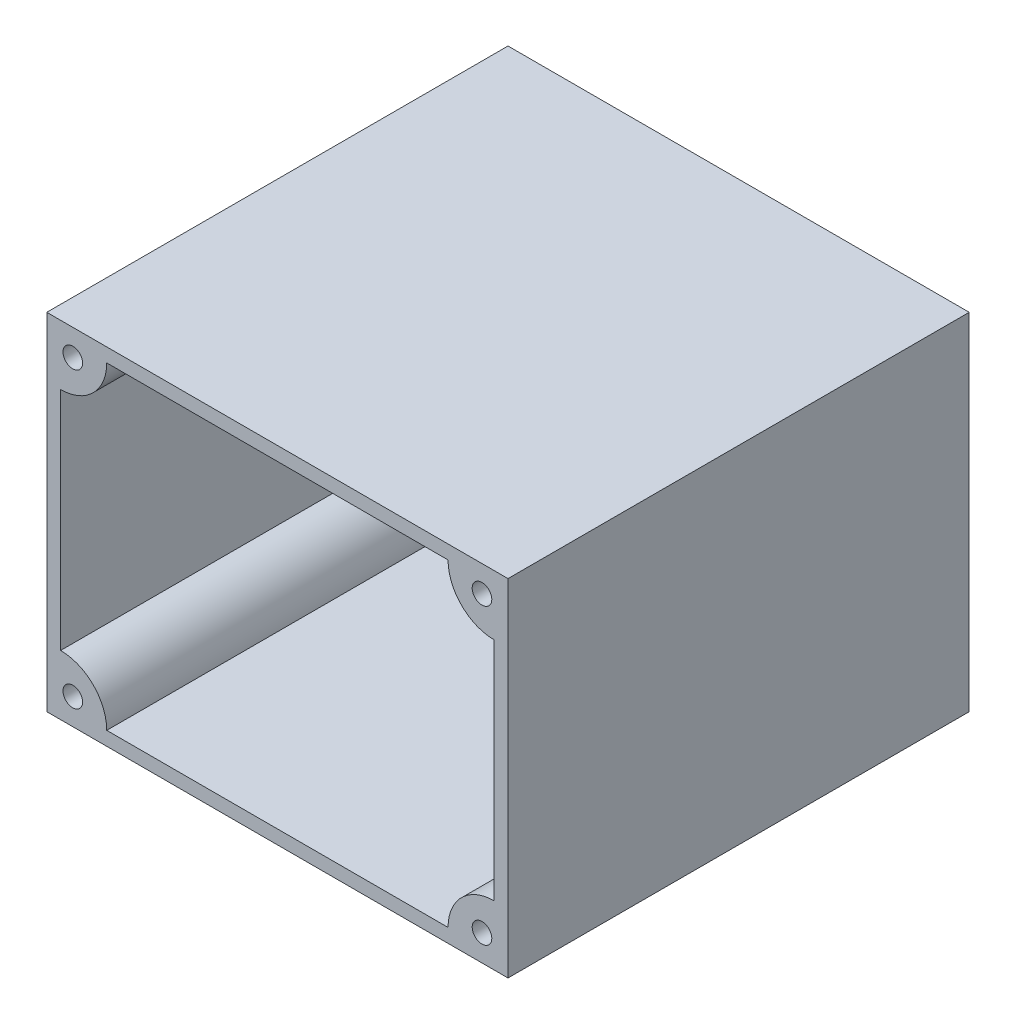
ISO-10303-21;
HEADER;
FILE_DESCRIPTION(('STEP AP214'),'2;1');
FILE_NAME('part.step','',(''),(''),'','','');
FILE_SCHEMA(('AUTOMOTIVE_DESIGN { 1 0 10303 214 1 1 1 1 }'));
ENDSEC;
DATA;
#1=APPLICATION_CONTEXT('core data for automotive mechanical design processes');
#2=APPLICATION_PROTOCOL_DEFINITION('international standard','automotive_design',2000,#1);
#3=PRODUCT_CONTEXT('',#1,'mechanical');
#4=PRODUCT('Part','Part','',(#3));
#5=PRODUCT_RELATED_PRODUCT_CATEGORY('part','',(#4));
#6=PRODUCT_DEFINITION_FORMATION('','',#4);
#7=PRODUCT_DEFINITION_CONTEXT('part definition',#1,'design');
#8=PRODUCT_DEFINITION('design','',#6,#7);
#9=PRODUCT_DEFINITION_SHAPE('','',#8);
#10=(LENGTH_UNIT() NAMED_UNIT(*) SI_UNIT(.MILLI.,.METRE.));
#11=(NAMED_UNIT(*) PLANE_ANGLE_UNIT() SI_UNIT($,.RADIAN.));
#12=(NAMED_UNIT(*) SI_UNIT($,.STERADIAN.) SOLID_ANGLE_UNIT());
#13=UNCERTAINTY_MEASURE_WITH_UNIT(LENGTH_MEASURE(1.E-05),#10,'distance_accuracy_value','');
#14=(GEOMETRIC_REPRESENTATION_CONTEXT(3) GLOBAL_UNCERTAINTY_ASSIGNED_CONTEXT((#13)) GLOBAL_UNIT_ASSIGNED_CONTEXT((#10,
#11,#12)) REPRESENTATION_CONTEXT('',''));
#15=CARTESIAN_POINT('',(0.,0.,0.));
#16=DIRECTION('',(0.,0.,1.));
#17=DIRECTION('',(1.,0.,0.));
#18=AXIS2_PLACEMENT_3D('',#15,#16,#17);
#19=CARTESIAN_POINT('',(0.,0.,2.4));
#20=DIRECTION('',(0.,0.,1.));
#21=DIRECTION('',(1.,0.,0.));
#22=AXIS2_PLACEMENT_3D('',#19,#20,#21);
#23=PLANE('',#22);
#24=CARTESIAN_POINT('',(37.6,-27.6,2.4));
#25=DIRECTION('',(0.,0.,1.));
#26=DIRECTION('',(1.,0.,0.));
#27=AXIS2_PLACEMENT_3D('',#24,#25,#26);
#28=CIRCLE('',#27,8.);
#29=CARTESIAN_POINT('',(29.6,-27.6,2.4));
#30=VERTEX_POINT('',#29);
#31=CARTESIAN_POINT('',(37.6,-19.6,2.4));
#32=VERTEX_POINT('',#31);
#33=EDGE_CURVE('E47',#30,#32,#28,.F.);
#34=ORIENTED_EDGE('',*,*,#33,.T.);
#35=DIRECTION('',(0.,1.,0.));
#36=VECTOR('',#35,1.);
#37=CARTESIAN_POINT('',(37.6,30.,2.4));
#38=LINE('',#37,#36);
#39=CARTESIAN_POINT('',(37.6,19.6,2.4));
#40=VERTEX_POINT('',#39);
#41=EDGE_CURVE('E197',#32,#40,#38,.T.);
#42=ORIENTED_EDGE('',*,*,#41,.T.);
#43=CARTESIAN_POINT('',(37.6,27.6,2.4));
#44=DIRECTION('',(0.,0.,1.));
#45=DIRECTION('',(1.,0.,0.));
#46=AXIS2_PLACEMENT_3D('',#43,#44,#45);
#47=CIRCLE('',#46,8.);
#48=CARTESIAN_POINT('',(29.6,27.6,2.4));
#49=VERTEX_POINT('',#48);
#50=EDGE_CURVE('E162',#49,#40,#47,.T.);
#51=ORIENTED_EDGE('',*,*,#50,.F.);
#52=DIRECTION('',(-1.,0.,0.));
#53=VECTOR('',#52,1.);
#54=CARTESIAN_POINT('',(-40.,27.6,2.4));
#55=LINE('',#54,#53);
#56=CARTESIAN_POINT('',(-29.6,27.6,2.4));
#57=VERTEX_POINT('',#56);
#58=EDGE_CURVE('E205',#49,#57,#55,.T.);
#59=ORIENTED_EDGE('',*,*,#58,.T.);
#60=CARTESIAN_POINT('',(-37.6,27.6,2.4));
#61=DIRECTION('',(0.,0.,1.));
#62=DIRECTION('',(1.,0.,0.));
#63=AXIS2_PLACEMENT_3D('',#60,#61,#62);
#64=CIRCLE('',#63,8.);
#65=CARTESIAN_POINT('',(-37.6,19.6,2.4));
#66=VERTEX_POINT('',#65);
#67=EDGE_CURVE('E193',#57,#66,#64,.F.);
#68=ORIENTED_EDGE('',*,*,#67,.T.);
#69=DIRECTION('',(0.,-1.,0.));
#70=VECTOR('',#69,1.);
#71=CARTESIAN_POINT('',(-37.6,30.,2.4));
#72=LINE('',#71,#70);
#73=CARTESIAN_POINT('',(-37.6,-19.6,2.4));
#74=VERTEX_POINT('',#73);
#75=EDGE_CURVE('E207',#66,#74,#72,.T.);
#76=ORIENTED_EDGE('',*,*,#75,.T.);
#77=CARTESIAN_POINT('',(-37.6,-27.6,2.4));
#78=DIRECTION('',(0.,0.,1.));
#79=DIRECTION('',(1.,0.,0.));
#80=AXIS2_PLACEMENT_3D('',#77,#78,#79);
#81=CIRCLE('',#80,8.);
#82=CARTESIAN_POINT('',(-29.6,-27.6,2.4));
#83=VERTEX_POINT('',#82);
#84=EDGE_CURVE('E173',#83,#74,#81,.T.);
#85=ORIENTED_EDGE('',*,*,#84,.F.);
#86=DIRECTION('',(1.,0.,0.));
#87=VECTOR('',#86,1.);
#88=CARTESIAN_POINT('',(-40.,-27.6,2.4));
#89=LINE('',#88,#87);
#90=EDGE_CURVE('E210',#83,#30,#89,.T.);
#91=ORIENTED_EDGE('',*,*,#90,.T.);
#92=EDGE_LOOP('',(#34,#42,#51,#59,#68,#76,#85,#91));
#93=FACE_BOUND('',#92,.T.);
#94=ADVANCED_FACE('F32',(#93),#23,.T.);
#95=CARTESIAN_POINT('',(37.6,30.,80.));
#96=DIRECTION('',(-1.,0.,0.));
#97=DIRECTION('',(0.,-1.,0.));
#98=AXIS2_PLACEMENT_3D('',#95,#96,#97);
#99=PLANE('',#98);
#100=DIRECTION('',(0.,0.,1.));
#101=VECTOR('',#100,1.);
#102=CARTESIAN_POINT('',(37.6,-19.6,-0.002000000000002));
#103=LINE('',#102,#101);
#104=CARTESIAN_POINT('',(37.6,-19.6,80.));
#105=VERTEX_POINT('',#104);
#106=EDGE_CURVE('E163',#32,#105,#103,.T.);
#107=ORIENTED_EDGE('',*,*,#106,.T.);
#108=DIRECTION('',(0.,1.,0.));
#109=VECTOR('',#108,1.);
#110=CARTESIAN_POINT('',(37.6,30.,80.));
#111=LINE('',#110,#109);
#112=CARTESIAN_POINT('',(37.6,19.6,80.));
#113=VERTEX_POINT('',#112);
#114=EDGE_CURVE('E212',#105,#113,#111,.T.);
#115=ORIENTED_EDGE('',*,*,#114,.T.);
#116=DIRECTION('',(0.,0.,1.));
#117=VECTOR('',#116,1.);
#118=CARTESIAN_POINT('',(37.6,19.6,-0.002000000000002));
#119=LINE('',#118,#117);
#120=EDGE_CURVE('E174',#40,#113,#119,.T.);
#121=ORIENTED_EDGE('',*,*,#120,.F.);
#122=ORIENTED_EDGE('',*,*,#41,.F.);
#123=EDGE_LOOP('',(#107,#115,#121,#122));
#124=FACE_BOUND('',#123,.T.);
#125=ADVANCED_FACE('F274',(#124),#99,.T.);
#126=CARTESIAN_POINT('',(-40.,27.6,80.));
#127=DIRECTION('',(0.,-1.,0.));
#128=DIRECTION('',(0.,0.,-1.));
#129=AXIS2_PLACEMENT_3D('',#126,#127,#128);
#130=PLANE('',#129);
#131=ORIENTED_EDGE('',*,*,#58,.F.);
#132=DIRECTION('',(0.,0.,1.));
#133=VECTOR('',#132,1.);
#134=CARTESIAN_POINT('',(29.6,27.6,-0.002000000000002));
#135=LINE('',#134,#133);
#136=CARTESIAN_POINT('',(29.6,27.6,80.));
#137=VERTEX_POINT('',#136);
#138=EDGE_CURVE('E169',#49,#137,#135,.T.);
#139=ORIENTED_EDGE('',*,*,#138,.T.);
#140=DIRECTION('',(-1.,0.,0.));
#141=VECTOR('',#140,1.);
#142=CARTESIAN_POINT('',(-40.,27.6,80.));
#143=LINE('',#142,#141);
#144=CARTESIAN_POINT('',(-29.6,27.6,80.));
#145=VERTEX_POINT('',#144);
#146=EDGE_CURVE('E214',#137,#145,#143,.T.);
#147=ORIENTED_EDGE('',*,*,#146,.T.);
#148=DIRECTION('',(0.,0.,1.));
#149=VECTOR('',#148,1.);
#150=CARTESIAN_POINT('',(-29.6,27.6,-0.002000000000002));
#151=LINE('',#150,#149);
#152=EDGE_CURVE('E198',#57,#145,#151,.T.);
#153=ORIENTED_EDGE('',*,*,#152,.F.);
#154=EDGE_LOOP('',(#131,#139,#147,#153));
#155=FACE_BOUND('',#154,.T.);
#156=ADVANCED_FACE('F279',(#155),#130,.T.);
#157=CARTESIAN_POINT('',(-37.6,30.,80.));
#158=DIRECTION('',(1.,0.,0.));
#159=DIRECTION('',(0.,1.,0.));
#160=AXIS2_PLACEMENT_3D('',#157,#158,#159);
#161=PLANE('',#160);
#162=DIRECTION('',(0.,-1.,0.));
#163=VECTOR('',#162,1.);
#164=CARTESIAN_POINT('',(-37.6,30.,80.));
#165=LINE('',#164,#163);
#166=CARTESIAN_POINT('',(-37.6,19.6,80.));
#167=VERTEX_POINT('',#166);
#168=CARTESIAN_POINT('',(-37.6,-19.6,80.));
#169=VERTEX_POINT('',#168);
#170=EDGE_CURVE('E216',#167,#169,#165,.T.);
#171=ORIENTED_EDGE('',*,*,#170,.T.);
#172=DIRECTION('',(0.,0.,1.));
#173=VECTOR('',#172,1.);
#174=CARTESIAN_POINT('',(-37.6,-19.6,-0.002000000000002));
#175=LINE('',#174,#173);
#176=EDGE_CURVE('E184',#74,#169,#175,.T.);
#177=ORIENTED_EDGE('',*,*,#176,.F.);
#178=ORIENTED_EDGE('',*,*,#75,.F.);
#179=DIRECTION('',(0.,0.,1.));
#180=VECTOR('',#179,1.);
#181=CARTESIAN_POINT('',(-37.6,19.6,-0.002000000000002));
#182=LINE('',#181,#180);
#183=EDGE_CURVE('E199',#66,#167,#182,.T.);
#184=ORIENTED_EDGE('',*,*,#183,.T.);
#185=EDGE_LOOP('',(#171,#177,#178,#184));
#186=FACE_BOUND('',#185,.T.);
#187=ADVANCED_FACE('F440',(#186),#161,.T.);
#188=CARTESIAN_POINT('',(-40.,-27.6,80.));
#189=DIRECTION('',(0.,1.,0.));
#190=DIRECTION('',(0.,0.,1.));
#191=AXIS2_PLACEMENT_3D('',#188,#189,#190);
#192=PLANE('',#191);
#193=DIRECTION('',(0.,0.,1.));
#194=VECTOR('',#193,1.);
#195=CARTESIAN_POINT('',(29.6,-27.6,-0.002000000000002));
#196=LINE('',#195,#194);
#197=CARTESIAN_POINT('',(29.6,-27.6,80.));
#198=VERTEX_POINT('',#197);
#199=EDGE_CURVE('E55',#30,#198,#196,.T.);
#200=ORIENTED_EDGE('',*,*,#199,.F.);
#201=ORIENTED_EDGE('',*,*,#90,.F.);
#202=DIRECTION('',(0.,0.,1.));
#203=VECTOR('',#202,1.);
#204=CARTESIAN_POINT('',(-29.6,-27.6,-0.002000000000002));
#205=LINE('',#204,#203);
#206=CARTESIAN_POINT('',(-29.6,-27.6,80.));
#207=VERTEX_POINT('',#206);
#208=EDGE_CURVE('E180',#83,#207,#205,.T.);
#209=ORIENTED_EDGE('',*,*,#208,.T.);
#210=DIRECTION('',(1.,0.,0.));
#211=VECTOR('',#210,1.);
#212=CARTESIAN_POINT('',(-40.,-27.6,80.));
#213=LINE('',#212,#211);
#214=EDGE_CURVE('E219',#207,#198,#213,.T.);
#215=ORIENTED_EDGE('',*,*,#214,.T.);
#216=EDGE_LOOP('',(#200,#201,#209,#215));
#217=FACE_BOUND('',#216,.T.);
#218=ADVANCED_FACE('F272',(#217),#192,.T.);
#219=CARTESIAN_POINT('',(40.,30.,80.));
#220=DIRECTION('',(-1.,0.,0.));
#221=DIRECTION('',(0.,-1.,0.));
#222=AXIS2_PLACEMENT_3D('',#219,#220,#221);
#223=PLANE('',#222);
#224=DIRECTION('',(0.,1.,0.));
#225=VECTOR('',#224,1.);
#226=CARTESIAN_POINT('',(40.,30.,0.));
#227=LINE('',#226,#225);
#228=CARTESIAN_POINT('',(40.,-30.,0.));
#229=VERTEX_POINT('',#228);
#230=CARTESIAN_POINT('',(40.,30.,0.));
#231=VERTEX_POINT('',#230);
#232=EDGE_CURVE('E221',#229,#231,#227,.T.);
#233=ORIENTED_EDGE('',*,*,#232,.T.);
#234=DIRECTION('',(0.,0.,-1.));
#235=VECTOR('',#234,1.);
#236=CARTESIAN_POINT('',(40.,30.,80.));
#237=LINE('',#236,#235);
#238=CARTESIAN_POINT('',(40.,30.,80.));
#239=VERTEX_POINT('',#238);
#240=EDGE_CURVE('E11',#239,#231,#237,.T.);
#241=ORIENTED_EDGE('',*,*,#240,.F.);
#242=DIRECTION('',(0.,1.,0.));
#243=VECTOR('',#242,1.);
#244=CARTESIAN_POINT('',(40.,30.,80.));
#245=LINE('',#244,#243);
#246=CARTESIAN_POINT('',(40.,-30.,80.));
#247=VERTEX_POINT('',#246);
#248=EDGE_CURVE('E222',#247,#239,#245,.T.);
#249=ORIENTED_EDGE('',*,*,#248,.F.);
#250=DIRECTION('',(0.,0.,-1.));
#251=VECTOR('',#250,1.);
#252=CARTESIAN_POINT('',(40.,-30.,80.));
#253=LINE('',#252,#251);
#254=EDGE_CURVE('E232',#247,#229,#253,.T.);
#255=ORIENTED_EDGE('',*,*,#254,.T.);
#256=EDGE_LOOP('',(#233,#241,#249,#255));
#257=FACE_BOUND('',#256,.T.);
#258=ADVANCED_FACE('F34',(#257),#223,.F.);
#259=CARTESIAN_POINT('',(-40.,30.,80.));
#260=DIRECTION('',(0.,-1.,0.));
#261=DIRECTION('',(0.,0.,-1.));
#262=AXIS2_PLACEMENT_3D('',#259,#260,#261);
#263=PLANE('',#262);
#264=DIRECTION('',(-1.,0.,0.));
#265=VECTOR('',#264,1.);
#266=CARTESIAN_POINT('',(-40.,30.,0.));
#267=LINE('',#266,#265);
#268=CARTESIAN_POINT('',(-40.,30.,0.));
#269=VERTEX_POINT('',#268);
#270=EDGE_CURVE('E235',#231,#269,#267,.T.);
#271=ORIENTED_EDGE('',*,*,#270,.T.);
#272=DIRECTION('',(0.,0.,-1.));
#273=VECTOR('',#272,1.);
#274=CARTESIAN_POINT('',(-40.,30.,80.));
#275=LINE('',#274,#273);
#276=CARTESIAN_POINT('',(-40.,30.,80.));
#277=VERTEX_POINT('',#276);
#278=EDGE_CURVE('E40',#277,#269,#275,.T.);
#279=ORIENTED_EDGE('',*,*,#278,.F.);
#280=DIRECTION('',(-1.,0.,0.));
#281=VECTOR('',#280,1.);
#282=CARTESIAN_POINT('',(-40.,30.,80.));
#283=LINE('',#282,#281);
#284=EDGE_CURVE('E225',#239,#277,#283,.T.);
#285=ORIENTED_EDGE('',*,*,#284,.F.);
#286=ORIENTED_EDGE('',*,*,#240,.T.);
#287=EDGE_LOOP('',(#271,#279,#285,#286));
#288=FACE_BOUND('',#287,.T.);
#289=ADVANCED_FACE('F265',(#288),#263,.F.);
#290=CARTESIAN_POINT('',(-40.,30.,80.));
#291=DIRECTION('',(1.,0.,0.));
#292=DIRECTION('',(0.,1.,0.));
#293=AXIS2_PLACEMENT_3D('',#290,#291,#292);
#294=PLANE('',#293);
#295=DIRECTION('',(0.,-1.,0.));
#296=VECTOR('',#295,1.);
#297=CARTESIAN_POINT('',(-40.,30.,0.));
#298=LINE('',#297,#296);
#299=CARTESIAN_POINT('',(-40.,-30.,0.));
#300=VERTEX_POINT('',#299);
#301=EDGE_CURVE('E237',#269,#300,#298,.T.);
#302=ORIENTED_EDGE('',*,*,#301,.T.);
#303=DIRECTION('',(0.,0.,-1.));
#304=VECTOR('',#303,1.);
#305=CARTESIAN_POINT('',(-40.,-30.,80.));
#306=LINE('',#305,#304);
#307=CARTESIAN_POINT('',(-40.,-30.,80.));
#308=VERTEX_POINT('',#307);
#309=EDGE_CURVE('E242',#308,#300,#306,.T.);
#310=ORIENTED_EDGE('',*,*,#309,.F.);
#311=DIRECTION('',(0.,-1.,0.));
#312=VECTOR('',#311,1.);
#313=CARTESIAN_POINT('',(-40.,30.,80.));
#314=LINE('',#313,#312);
#315=EDGE_CURVE('E228',#277,#308,#314,.T.);
#316=ORIENTED_EDGE('',*,*,#315,.F.);
#317=ORIENTED_EDGE('',*,*,#278,.T.);
#318=EDGE_LOOP('',(#302,#310,#316,#317));
#319=FACE_BOUND('',#318,.T.);
#320=ADVANCED_FACE('F249',(#319),#294,.F.);
#321=CARTESIAN_POINT('',(-40.,-30.,80.));
#322=DIRECTION('',(0.,1.,0.));
#323=DIRECTION('',(0.,0.,1.));
#324=AXIS2_PLACEMENT_3D('',#321,#322,#323);
#325=PLANE('',#324);
#326=DIRECTION('',(1.,0.,0.));
#327=VECTOR('',#326,1.);
#328=CARTESIAN_POINT('',(-40.,-30.,0.));
#329=LINE('',#328,#327);
#330=EDGE_CURVE('E226',#300,#229,#329,.T.);
#331=ORIENTED_EDGE('',*,*,#330,.T.);
#332=ORIENTED_EDGE('',*,*,#254,.F.);
#333=DIRECTION('',(1.,0.,0.));
#334=VECTOR('',#333,1.);
#335=CARTESIAN_POINT('',(-40.,-30.,80.));
#336=LINE('',#335,#334);
#337=EDGE_CURVE('E230',#308,#247,#336,.T.);
#338=ORIENTED_EDGE('',*,*,#337,.F.);
#339=ORIENTED_EDGE('',*,*,#309,.T.);
#340=EDGE_LOOP('',(#331,#332,#338,#339));
#341=FACE_BOUND('',#340,.T.);
#342=ADVANCED_FACE('F258',(#341),#325,.F.);
#343=CARTESIAN_POINT('',(0.,0.,80.));
#344=DIRECTION('',(0.,0.,1.));
#345=DIRECTION('',(1.,0.,0.));
#346=AXIS2_PLACEMENT_3D('',#343,#344,#345);
#347=PLANE('',#346);
#348=CARTESIAN_POINT('',(35.4882310319587,-25.4606514026197,80.));
#349=DIRECTION('',(0.,0.,1.));
#350=DIRECTION('',(1.,0.,0.));
#351=AXIS2_PLACEMENT_3D('',#348,#349,#350);
#352=CIRCLE('',#351,1.69999999999999);
#353=CARTESIAN_POINT('',(37.1882310319587,-25.4606514026197,80.));
#354=VERTEX_POINT('',#353);
#355=EDGE_CURVE('E143',#354,#354,#352,.T.);
#356=ORIENTED_EDGE('',*,*,#355,.F.);
#357=EDGE_LOOP('',(#356));
#358=FACE_BOUND('',#357,.T.);
#359=CARTESIAN_POINT('',(35.4882310319587,25.4606514026197,80.));
#360=DIRECTION('',(0.,0.,1.));
#361=DIRECTION('',(1.,0.,0.));
#362=AXIS2_PLACEMENT_3D('',#359,#360,#361);
#363=CIRCLE('',#362,1.69999999999999);
#364=CARTESIAN_POINT('',(37.1882310319587,25.4606514026197,80.));
#365=VERTEX_POINT('',#364);
#366=EDGE_CURVE('E142',#365,#365,#363,.T.);
#367=ORIENTED_EDGE('',*,*,#366,.F.);
#368=EDGE_LOOP('',(#367));
#369=FACE_BOUND('',#368,.T.);
#370=CARTESIAN_POINT('',(-35.4882310319587,-25.4606514026197,80.));
#371=DIRECTION('',(0.,0.,1.));
#372=DIRECTION('',(1.,0.,0.));
#373=AXIS2_PLACEMENT_3D('',#370,#371,#372);
#374=CIRCLE('',#373,1.69999999999999);
#375=CARTESIAN_POINT('',(-33.7882310319587,-25.4606514026197,80.));
#376=VERTEX_POINT('',#375);
#377=EDGE_CURVE('E153',#376,#376,#374,.T.);
#378=ORIENTED_EDGE('',*,*,#377,.F.);
#379=EDGE_LOOP('',(#378));
#380=FACE_BOUND('',#379,.T.);
#381=ORIENTED_EDGE('',*,*,#114,.F.);
#382=CARTESIAN_POINT('',(37.6,-27.6,80.));
#383=DIRECTION('',(0.,0.,1.));
#384=DIRECTION('',(-1.,0.,0.));
#385=AXIS2_PLACEMENT_3D('',#382,#383,#384);
#386=CIRCLE('',#385,8.);
#387=EDGE_CURVE('E159',#105,#198,#386,.T.);
#388=ORIENTED_EDGE('',*,*,#387,.T.);
#389=ORIENTED_EDGE('',*,*,#214,.F.);
#390=CARTESIAN_POINT('',(-37.6,-27.6,80.));
#391=DIRECTION('',(0.,0.,-1.));
#392=DIRECTION('',(1.,0.,0.));
#393=AXIS2_PLACEMENT_3D('',#390,#391,#392);
#394=CIRCLE('',#393,8.);
#395=EDGE_CURVE('E181',#169,#207,#394,.T.);
#396=ORIENTED_EDGE('',*,*,#395,.F.);
#397=ORIENTED_EDGE('',*,*,#170,.F.);
#398=CARTESIAN_POINT('',(-37.6,27.6,80.));
#399=DIRECTION('',(0.,0.,1.));
#400=DIRECTION('',(1.,0.,0.));
#401=AXIS2_PLACEMENT_3D('',#398,#399,#400);
#402=CIRCLE('',#401,8.);
#403=EDGE_CURVE('E194',#167,#145,#402,.T.);
#404=ORIENTED_EDGE('',*,*,#403,.T.);
#405=ORIENTED_EDGE('',*,*,#146,.F.);
#406=CARTESIAN_POINT('',(37.6,27.6,80.));
#407=DIRECTION('',(0.,0.,-1.));
#408=DIRECTION('',(-1.,0.,0.));
#409=AXIS2_PLACEMENT_3D('',#406,#407,#408);
#410=CIRCLE('',#409,8.);
#411=EDGE_CURVE('E170',#113,#137,#410,.T.);
#412=ORIENTED_EDGE('',*,*,#411,.F.);
#413=EDGE_LOOP('',(#381,#388,#389,#396,#397,#404,#405,#412));
#414=FACE_BOUND('',#413,.T.);
#415=CARTESIAN_POINT('',(-35.4882310319587,25.4606514026197,80.));
#416=DIRECTION('',(0.,0.,1.));
#417=DIRECTION('',(1.,0.,0.));
#418=AXIS2_PLACEMENT_3D('',#415,#416,#417);
#419=CIRCLE('',#418,1.69999999999999);
#420=CARTESIAN_POINT('',(-33.7882310319587,25.4606514026197,80.));
#421=VERTEX_POINT('',#420);
#422=EDGE_CURVE('E183',#421,#421,#419,.T.);
#423=ORIENTED_EDGE('',*,*,#422,.F.);
#424=EDGE_LOOP('',(#423));
#425=FACE_BOUND('',#424,.T.);
#426=ORIENTED_EDGE('',*,*,#248,.T.);
#427=ORIENTED_EDGE('',*,*,#284,.T.);
#428=ORIENTED_EDGE('',*,*,#315,.T.);
#429=ORIENTED_EDGE('',*,*,#337,.T.);
#430=EDGE_LOOP('',(#426,#427,#428,#429));
#431=FACE_BOUND('',#430,.T.);
#432=ADVANCED_FACE('F264',(#358,#369,#380,#414,#425,#431),#347,.T.);
#433=CARTESIAN_POINT('',(0.,0.,0.));
#434=DIRECTION('',(0.,0.,1.));
#435=DIRECTION('',(1.,0.,0.));
#436=AXIS2_PLACEMENT_3D('',#433,#434,#435);
#437=PLANE('',#436);
#438=ORIENTED_EDGE('',*,*,#232,.F.);
#439=ORIENTED_EDGE('',*,*,#330,.F.);
#440=ORIENTED_EDGE('',*,*,#301,.F.);
#441=ORIENTED_EDGE('',*,*,#270,.F.);
#442=EDGE_LOOP('',(#438,#439,#440,#441));
#443=FACE_BOUND('',#442,.T.);
#444=ADVANCED_FACE('F255',(#443),#437,.F.);
#445=CARTESIAN_POINT('',(-37.6,27.6,-0.002000000000002));
#446=DIRECTION('',(0.,0.,1.));
#447=DIRECTION('',(1.,0.,0.));
#448=AXIS2_PLACEMENT_3D('',#445,#446,#447);
#449=CYLINDRICAL_SURFACE('',#448,8.);
#450=ORIENTED_EDGE('',*,*,#67,.F.);
#451=ORIENTED_EDGE('',*,*,#152,.T.);
#452=ORIENTED_EDGE('',*,*,#403,.F.);
#453=ORIENTED_EDGE('',*,*,#183,.F.);
#454=EDGE_LOOP('',(#450,#451,#452,#453));
#455=FACE_BOUND('',#454,.T.);
#456=ADVANCED_FACE('F290',(#455),#449,.T.);
#457=CARTESIAN_POINT('',(-35.4882310319587,25.4606514026197,70.));
#458=DIRECTION('',(0.,0.,1.));
#459=DIRECTION('',(1.,0.,0.));
#460=AXIS2_PLACEMENT_3D('',#457,#458,#459);
#461=CONICAL_SURFACE('',#460,1.69999999999999,1.02974425867665);
#462=CARTESIAN_POINT('',(-35.4882310319587,25.4606514026197,68.9785369476532));
#463=VERTEX_POINT('',#462);
#464=VERTEX_LOOP('',#463);
#465=FACE_BOUND('',#464,.T.);
#466=CARTESIAN_POINT('',(-35.4882310319587,25.4606514026197,70.));
#467=DIRECTION('',(0.,0.,1.));
#468=DIRECTION('',(1.,0.,0.));
#469=AXIS2_PLACEMENT_3D('',#466,#467,#468);
#470=CIRCLE('',#469,1.69999999999999);
#471=CARTESIAN_POINT('',(-33.7882310319588,25.4606514026197,70.));
#472=VERTEX_POINT('',#471);
#473=EDGE_CURVE('E190',#472,#472,#470,.T.);
#474=ORIENTED_EDGE('',*,*,#473,.T.);
#475=EDGE_LOOP('',(#474));
#476=FACE_BOUND('',#475,.T.);
#477=ADVANCED_FACE('F312',(#465,#476),#461,.F.);
#478=CARTESIAN_POINT('',(-35.4882310319587,25.4606514026197,80.));
#479=DIRECTION('',(0.,0.,1.));
#480=DIRECTION('',(1.,0.,0.));
#481=AXIS2_PLACEMENT_3D('',#478,#479,#480);
#482=CYLINDRICAL_SURFACE('',#481,1.69999999999999);
#483=ORIENTED_EDGE('',*,*,#473,.F.);
#484=EDGE_LOOP('',(#483));
#485=FACE_BOUND('',#484,.T.);
#486=ORIENTED_EDGE('',*,*,#422,.T.);
#487=EDGE_LOOP('',(#486));
#488=FACE_BOUND('',#487,.T.);
#489=ADVANCED_FACE('F320',(#485,#488),#482,.F.);
#490=CARTESIAN_POINT('',(-37.6,-27.6,-0.002000000000002));
#491=DIRECTION('',(0.,0.,1.));
#492=DIRECTION('',(1.,0.,0.));
#493=AXIS2_PLACEMENT_3D('',#490,#491,#492);
#494=CYLINDRICAL_SURFACE('',#493,8.);
#495=ORIENTED_EDGE('',*,*,#208,.F.);
#496=ORIENTED_EDGE('',*,*,#84,.T.);
#497=ORIENTED_EDGE('',*,*,#176,.T.);
#498=ORIENTED_EDGE('',*,*,#395,.T.);
#499=EDGE_LOOP('',(#495,#496,#497,#498));
#500=FACE_BOUND('',#499,.T.);
#501=ADVANCED_FACE('F328',(#500),#494,.T.);
#502=CARTESIAN_POINT('',(37.6,27.6,-0.002000000000002));
#503=DIRECTION('',(0.,0.,1.));
#504=DIRECTION('',(1.,0.,0.));
#505=AXIS2_PLACEMENT_3D('',#502,#503,#504);
#506=CYLINDRICAL_SURFACE('',#505,8.);
#507=ORIENTED_EDGE('',*,*,#138,.F.);
#508=ORIENTED_EDGE('',*,*,#50,.T.);
#509=ORIENTED_EDGE('',*,*,#120,.T.);
#510=ORIENTED_EDGE('',*,*,#411,.T.);
#511=EDGE_LOOP('',(#507,#508,#509,#510));
#512=FACE_BOUND('',#511,.T.);
#513=ADVANCED_FACE('F335',(#512),#506,.T.);
#514=CARTESIAN_POINT('',(37.6,-27.6,-0.002000000000002));
#515=DIRECTION('',(0.,0.,1.));
#516=DIRECTION('',(1.,0.,0.));
#517=AXIS2_PLACEMENT_3D('',#514,#515,#516);
#518=CYLINDRICAL_SURFACE('',#517,8.);
#519=ORIENTED_EDGE('',*,*,#33,.F.);
#520=ORIENTED_EDGE('',*,*,#199,.T.);
#521=ORIENTED_EDGE('',*,*,#387,.F.);
#522=ORIENTED_EDGE('',*,*,#106,.F.);
#523=EDGE_LOOP('',(#519,#520,#521,#522));
#524=FACE_BOUND('',#523,.T.);
#525=ADVANCED_FACE('F343',(#524),#518,.T.);
#526=CARTESIAN_POINT('',(-35.4882310319587,-25.4606514026197,70.));
#527=DIRECTION('',(0.,0.,1.));
#528=DIRECTION('',(1.,0.,0.));
#529=AXIS2_PLACEMENT_3D('',#526,#527,#528);
#530=CONICAL_SURFACE('',#529,1.69999999999999,1.02974425867665);
#531=CARTESIAN_POINT('',(-35.4882310319587,-25.4606514026197,68.9785369476532));
#532=VERTEX_POINT('',#531);
#533=VERTEX_LOOP('',#532);
#534=FACE_BOUND('',#533,.T.);
#535=CARTESIAN_POINT('',(-35.4882310319587,-25.4606514026197,70.));
#536=DIRECTION('',(0.,0.,1.));
#537=DIRECTION('',(1.,0.,0.));
#538=AXIS2_PLACEMENT_3D('',#535,#536,#537);
#539=CIRCLE('',#538,1.69999999999999);
#540=CARTESIAN_POINT('',(-33.7882310319588,-25.4606514026197,70.));
#541=VERTEX_POINT('',#540);
#542=EDGE_CURVE('E156',#541,#541,#539,.T.);
#543=ORIENTED_EDGE('',*,*,#542,.T.);
#544=EDGE_LOOP('',(#543));
#545=FACE_BOUND('',#544,.T.);
#546=ADVANCED_FACE('F351',(#534,#545),#530,.F.);
#547=CARTESIAN_POINT('',(-35.4882310319587,-25.4606514026197,80.));
#548=DIRECTION('',(0.,0.,1.));
#549=DIRECTION('',(1.,0.,0.));
#550=AXIS2_PLACEMENT_3D('',#547,#548,#549);
#551=CYLINDRICAL_SURFACE('',#550,1.69999999999999);
#552=ORIENTED_EDGE('',*,*,#542,.F.);
#553=EDGE_LOOP('',(#552));
#554=FACE_BOUND('',#553,.T.);
#555=ORIENTED_EDGE('',*,*,#377,.T.);
#556=EDGE_LOOP('',(#555));
#557=FACE_BOUND('',#556,.T.);
#558=ADVANCED_FACE('F359',(#554,#557),#551,.F.);
#559=CARTESIAN_POINT('',(35.4882310319587,25.4606514026197,70.));
#560=DIRECTION('',(0.,0.,1.));
#561=DIRECTION('',(1.,0.,0.));
#562=AXIS2_PLACEMENT_3D('',#559,#560,#561);
#563=CONICAL_SURFACE('',#562,1.69999999999999,1.02974425867665);
#564=CARTESIAN_POINT('',(35.4882310319587,25.4606514026197,68.9785369476532));
#565=VERTEX_POINT('',#564);
#566=VERTEX_LOOP('',#565);
#567=FACE_BOUND('',#566,.T.);
#568=CARTESIAN_POINT('',(35.4882310319587,25.4606514026197,70.));
#569=DIRECTION('',(0.,0.,1.));
#570=DIRECTION('',(1.,0.,0.));
#571=AXIS2_PLACEMENT_3D('',#568,#569,#570);
#572=CIRCLE('',#571,1.69999999999999);
#573=CARTESIAN_POINT('',(37.1882310319587,25.4606514026197,70.));
#574=VERTEX_POINT('',#573);
#575=EDGE_CURVE('E146',#574,#574,#572,.T.);
#576=ORIENTED_EDGE('',*,*,#575,.T.);
#577=EDGE_LOOP('',(#576));
#578=FACE_BOUND('',#577,.T.);
#579=ADVANCED_FACE('F367',(#567,#578),#563,.F.);
#580=CARTESIAN_POINT('',(35.4882310319587,25.4606514026197,80.));
#581=DIRECTION('',(0.,0.,1.));
#582=DIRECTION('',(1.,0.,0.));
#583=AXIS2_PLACEMENT_3D('',#580,#581,#582);
#584=CYLINDRICAL_SURFACE('',#583,1.69999999999999);
#585=ORIENTED_EDGE('',*,*,#575,.F.);
#586=EDGE_LOOP('',(#585));
#587=FACE_BOUND('',#586,.T.);
#588=ORIENTED_EDGE('',*,*,#366,.T.);
#589=EDGE_LOOP('',(#588));
#590=FACE_BOUND('',#589,.T.);
#591=ADVANCED_FACE('F136',(#587,#590),#584,.F.);
#592=CARTESIAN_POINT('',(35.4882310319587,-25.4606514026197,70.));
#593=DIRECTION('',(0.,0.,1.));
#594=DIRECTION('',(1.,0.,0.));
#595=AXIS2_PLACEMENT_3D('',#592,#593,#594);
#596=CONICAL_SURFACE('',#595,1.69999999999999,1.02974425867665);
#597=CARTESIAN_POINT('',(35.4882310319587,-25.4606514026197,68.9785369476532));
#598=VERTEX_POINT('',#597);
#599=VERTEX_LOOP('',#598);
#600=FACE_BOUND('',#599,.T.);
#601=CARTESIAN_POINT('',(35.4882310319587,-25.4606514026197,70.));
#602=DIRECTION('',(0.,0.,1.));
#603=DIRECTION('',(1.,0.,0.));
#604=AXIS2_PLACEMENT_3D('',#601,#602,#603);
#605=CIRCLE('',#604,1.69999999999999);
#606=CARTESIAN_POINT('',(37.1882310319587,-25.4606514026197,70.));
#607=VERTEX_POINT('',#606);
#608=EDGE_CURVE('E140',#607,#607,#605,.T.);
#609=ORIENTED_EDGE('',*,*,#608,.T.);
#610=EDGE_LOOP('',(#609));
#611=FACE_BOUND('',#610,.T.);
#612=ADVANCED_FACE('F132',(#600,#611),#596,.F.);
#613=CARTESIAN_POINT('',(35.4882310319587,-25.4606514026197,80.));
#614=DIRECTION('',(0.,0.,1.));
#615=DIRECTION('',(1.,0.,0.));
#616=AXIS2_PLACEMENT_3D('',#613,#614,#615);
#617=CYLINDRICAL_SURFACE('',#616,1.69999999999999);
#618=ORIENTED_EDGE('',*,*,#608,.F.);
#619=EDGE_LOOP('',(#618));
#620=FACE_BOUND('',#619,.T.);
#621=ORIENTED_EDGE('',*,*,#355,.T.);
#622=EDGE_LOOP('',(#621));
#623=FACE_BOUND('',#622,.T.);
#624=ADVANCED_FACE('F135',(#620,#623),#617,.F.);
#625=CLOSED_SHELL('',(#94,#125,#156,#187,#218,#258,#289,#320,#342,#432,#444,#456,#477,#489,#501,
#513,#525,#546,#558,#579,#591,#612,#624));
#626=MANIFOLD_SOLID_BREP('B2',#625);
#627=ADVANCED_BREP_SHAPE_REPRESENTATION('',(#18,#626),#14);
#628=SHAPE_DEFINITION_REPRESENTATION(#9,#627);
ENDSEC;
END-ISO-10303-21;
